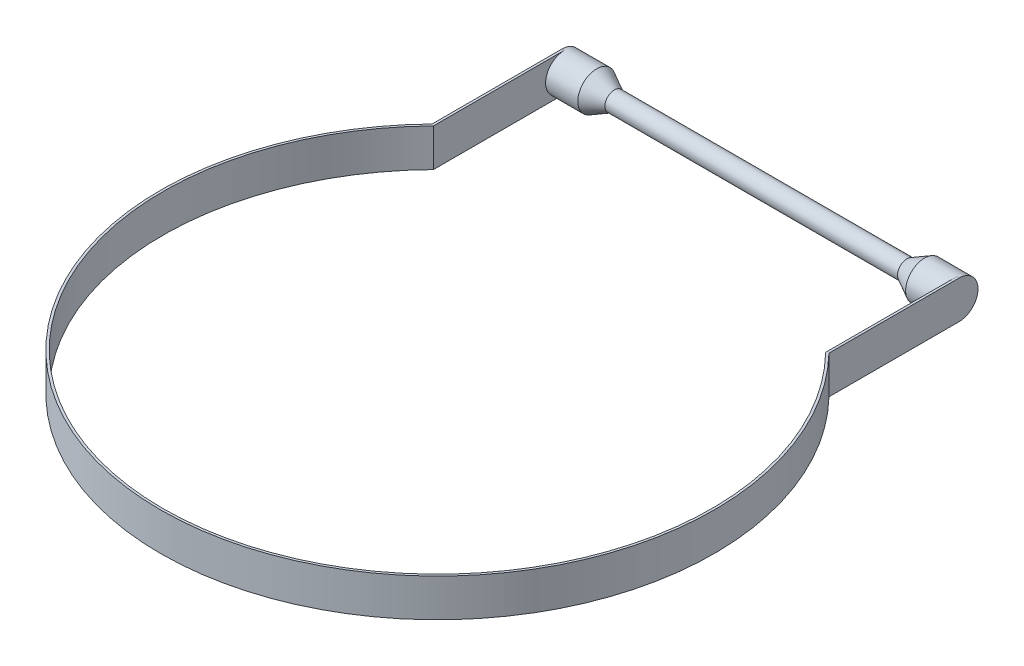
ISO-10303-21;
HEADER;
FILE_DESCRIPTION(('STEP AP214'),'2;1');
FILE_NAME('part.step','',(''),(''),'','','');
FILE_SCHEMA(('AUTOMOTIVE_DESIGN { 1 0 10303 214 1 1 1 1 }'));
ENDSEC;
DATA;
#1=APPLICATION_CONTEXT('core data for automotive mechanical design processes');
#2=APPLICATION_PROTOCOL_DEFINITION('international standard','automotive_design',2000,#1);
#3=PRODUCT_CONTEXT('',#1,'mechanical');
#4=PRODUCT('Part','Part','',(#3));
#5=PRODUCT_RELATED_PRODUCT_CATEGORY('part','',(#4));
#6=PRODUCT_DEFINITION_FORMATION('','',#4);
#7=PRODUCT_DEFINITION_CONTEXT('part definition',#1,'design');
#8=PRODUCT_DEFINITION('design','',#6,#7);
#9=PRODUCT_DEFINITION_SHAPE('','',#8);
#10=(LENGTH_UNIT() NAMED_UNIT(*) SI_UNIT(.MILLI.,.METRE.));
#11=(NAMED_UNIT(*) PLANE_ANGLE_UNIT() SI_UNIT($,.RADIAN.));
#12=(NAMED_UNIT(*) SI_UNIT($,.STERADIAN.) SOLID_ANGLE_UNIT());
#13=UNCERTAINTY_MEASURE_WITH_UNIT(LENGTH_MEASURE(1.E-05),#10,'distance_accuracy_value','');
#14=(GEOMETRIC_REPRESENTATION_CONTEXT(3) GLOBAL_UNCERTAINTY_ASSIGNED_CONTEXT((#13)) GLOBAL_UNIT_ASSIGNED_CONTEXT((#10,
#11,#12)) REPRESENTATION_CONTEXT('',''));
#15=CARTESIAN_POINT('',(0.,0.,0.));
#16=DIRECTION('',(0.,0.,1.));
#17=DIRECTION('',(1.,0.,0.));
#18=AXIS2_PLACEMENT_3D('',#15,#16,#17);
#19=CARTESIAN_POINT('',(-253.005,24.125,0.));
#20=DIRECTION('',(1.,0.,0.));
#21=DIRECTION('',(0.,0.,-1.));
#22=AXIS2_PLACEMENT_3D('',#19,#20,#21);
#23=PLANE('',#22);
#24=CARTESIAN_POINT('',(-253.005,0.,0.));
#25=DIRECTION('',(-1.,0.,0.));
#26=DIRECTION('',(0.,0.,1.));
#27=AXIS2_PLACEMENT_3D('',#24,#25,#26);
#28=CIRCLE('',#27,24.125);
#29=CARTESIAN_POINT('',(-253.005,24.125,0.));
#30=VERTEX_POINT('',#29);
#31=CARTESIAN_POINT('',(-253.005,-24.125,0.));
#32=VERTEX_POINT('',#31);
#33=EDGE_CURVE('E74',#30,#32,#28,.T.);
#34=ORIENTED_EDGE('',*,*,#33,.T.);
#35=DIRECTION('',(0.,0.,1.));
#36=VECTOR('',#35,1.);
#37=CARTESIAN_POINT('',(-253.005,-24.125,0.));
#38=LINE('',#37,#36);
#39=CARTESIAN_POINT('',(-253.005,-24.125,165.889796395397));
#40=VERTEX_POINT('',#39);
#41=EDGE_CURVE('E117',#32,#40,#38,.T.);
#42=ORIENTED_EDGE('',*,*,#41,.T.);
#43=DIRECTION('',(0.,-1.,0.));
#44=VECTOR('',#43,1.);
#45=CARTESIAN_POINT('',(-253.005,24.125,165.889796395397));
#46=LINE('',#45,#44);
#47=CARTESIAN_POINT('',(-253.005,24.125,165.889796395397));
#48=VERTEX_POINT('',#47);
#49=EDGE_CURVE('E157',#48,#40,#46,.T.);
#50=ORIENTED_EDGE('',*,*,#49,.F.);
#51=DIRECTION('',(0.,0.,1.));
#52=VECTOR('',#51,1.);
#53=CARTESIAN_POINT('',(-253.005,24.125,0.));
#54=LINE('',#53,#52);
#55=EDGE_CURVE('E119',#30,#48,#54,.T.);
#56=ORIENTED_EDGE('',*,*,#55,.F.);
#57=EDGE_LOOP('',(#34,#42,#50,#56));
#58=FACE_BOUND('',#57,.T.);
#59=ADVANCED_FACE('F52',(#58),#23,.F.);
#60=CARTESIAN_POINT('',(253.005,24.125,0.));
#61=DIRECTION('',(1.,0.,0.));
#62=DIRECTION('',(0.,0.,-1.));
#63=AXIS2_PLACEMENT_3D('',#60,#61,#62);
#64=PLANE('',#63);
#65=DIRECTION('',(0.,0.,1.));
#66=VECTOR('',#65,1.);
#67=CARTESIAN_POINT('',(253.005,-24.125,0.));
#68=LINE('',#67,#66);
#69=CARTESIAN_POINT('',(253.005,-24.125,0.));
#70=VERTEX_POINT('',#69);
#71=CARTESIAN_POINT('',(253.005,-24.125,165.889796395396));
#72=VERTEX_POINT('',#71);
#73=EDGE_CURVE('E133',#70,#72,#68,.T.);
#74=ORIENTED_EDGE('',*,*,#73,.F.);
#75=CARTESIAN_POINT('',(253.005,0.,0.));
#76=DIRECTION('',(1.,0.,0.));
#77=DIRECTION('',(0.,0.,-1.));
#78=AXIS2_PLACEMENT_3D('',#75,#76,#77);
#79=CIRCLE('',#78,24.125);
#80=CARTESIAN_POINT('',(253.005,24.125,0.));
#81=VERTEX_POINT('',#80);
#82=EDGE_CURVE('E66',#70,#81,#79,.T.);
#83=ORIENTED_EDGE('',*,*,#82,.T.);
#84=DIRECTION('',(0.,0.,1.));
#85=VECTOR('',#84,1.);
#86=CARTESIAN_POINT('',(253.005,24.125,0.));
#87=LINE('',#86,#85);
#88=CARTESIAN_POINT('',(253.005,24.125,165.889796395396));
#89=VERTEX_POINT('',#88);
#90=EDGE_CURVE('E184',#81,#89,#87,.T.);
#91=ORIENTED_EDGE('',*,*,#90,.T.);
#92=DIRECTION('',(0.,-1.,0.));
#93=VECTOR('',#92,1.);
#94=CARTESIAN_POINT('',(253.005,24.125,165.889796395396));
#95=LINE('',#94,#93);
#96=EDGE_CURVE('E154',#89,#72,#95,.T.);
#97=ORIENTED_EDGE('',*,*,#96,.T.);
#98=EDGE_LOOP('',(#74,#83,#91,#97));
#99=FACE_BOUND('',#98,.T.);
#100=ADVANCED_FACE('F207',(#99),#64,.T.);
#101=CARTESIAN_POINT('',(0.,-24.125,0.));
#102=DIRECTION('',(0.,1.,0.));
#103=DIRECTION('',(0.,0.,1.));
#104=AXIS2_PLACEMENT_3D('',#101,#102,#103);
#105=PLANE('',#104);
#106=DIRECTION('',(-1.,0.,0.));
#107=VECTOR('',#106,1.);
#108=CARTESIAN_POINT('',(353.005,-24.125,0.));
#109=LINE('',#108,#107);
#110=CARTESIAN_POINT('',(250.,-24.125,0.));
#111=VERTEX_POINT('',#110);
#112=EDGE_CURVE('E12',#70,#111,#109,.T.);
#113=ORIENTED_EDGE('',*,*,#112,.F.);
#114=ORIENTED_EDGE('',*,*,#73,.T.);
#115=CARTESIAN_POINT('',(0.,-24.125,412.0625));
#116=DIRECTION('',(0.,1.,0.));
#117=DIRECTION('',(0.,0.,1.));
#118=AXIS2_PLACEMENT_3D('',#115,#116,#117);
#119=CIRCLE('',#118,353.005);
#120=EDGE_CURVE('E130',#40,#72,#119,.T.);
#121=ORIENTED_EDGE('',*,*,#120,.F.);
#122=ORIENTED_EDGE('',*,*,#41,.F.);
#123=CARTESIAN_POINT('',(-250.,-24.125,0.));
#124=VERTEX_POINT('',#123);
#125=EDGE_CURVE('E56',#124,#32,#109,.T.);
#126=ORIENTED_EDGE('',*,*,#125,.F.);
#127=DIRECTION('',(0.,0.,1.));
#128=VECTOR('',#127,1.);
#129=CARTESIAN_POINT('',(-250.,-24.125,0.));
#130=LINE('',#129,#128);
#131=CARTESIAN_POINT('',(-250.,-24.125,167.113525721682));
#132=VERTEX_POINT('',#131);
#133=EDGE_CURVE('E146',#124,#132,#130,.T.);
#134=ORIENTED_EDGE('',*,*,#133,.T.);
#135=CARTESIAN_POINT('',(0.,-24.125,412.0625));
#136=DIRECTION('',(0.,1.,0.));
#137=DIRECTION('',(0.,0.,1.));
#138=AXIS2_PLACEMENT_3D('',#135,#136,#137);
#139=CIRCLE('',#138,350.);
#140=CARTESIAN_POINT('',(250.,-24.125,167.113525721682));
#141=VERTEX_POINT('',#140);
#142=EDGE_CURVE('E143',#132,#141,#139,.T.);
#143=ORIENTED_EDGE('',*,*,#142,.T.);
#144=DIRECTION('',(0.,0.,1.));
#145=VECTOR('',#144,1.);
#146=CARTESIAN_POINT('',(250.,-24.125,0.));
#147=LINE('',#146,#145);
#148=EDGE_CURVE('E141',#111,#141,#147,.T.);
#149=ORIENTED_EDGE('',*,*,#148,.F.);
#150=EDGE_LOOP('',(#113,#114,#121,#122,#126,#134,#143,#149));
#151=FACE_BOUND('',#150,.T.);
#152=ADVANCED_FACE('F128',(#151),#105,.F.);
#153=CARTESIAN_POINT('',(0.,24.125,0.));
#154=DIRECTION('',(0.,1.,0.));
#155=DIRECTION('',(0.,0.,1.));
#156=AXIS2_PLACEMENT_3D('',#153,#154,#155);
#157=PLANE('',#156);
#158=ORIENTED_EDGE('',*,*,#90,.F.);
#159=DIRECTION('',(-1.,0.,0.));
#160=VECTOR('',#159,1.);
#161=CARTESIAN_POINT('',(353.005,24.125,0.));
#162=LINE('',#161,#160);
#163=CARTESIAN_POINT('',(250.,24.125,0.));
#164=VERTEX_POINT('',#163);
#165=EDGE_CURVE('E127',#81,#164,#162,.T.);
#166=ORIENTED_EDGE('',*,*,#165,.T.);
#167=DIRECTION('',(0.,0.,1.));
#168=VECTOR('',#167,1.);
#169=CARTESIAN_POINT('',(250.,24.125,0.));
#170=LINE('',#169,#168);
#171=CARTESIAN_POINT('',(250.,24.125,167.113525721682));
#172=VERTEX_POINT('',#171);
#173=EDGE_CURVE('E181',#164,#172,#170,.T.);
#174=ORIENTED_EDGE('',*,*,#173,.T.);
#175=CARTESIAN_POINT('',(0.,24.125,412.0625));
#176=DIRECTION('',(0.,1.,0.));
#177=DIRECTION('',(0.,0.,1.));
#178=AXIS2_PLACEMENT_3D('',#175,#176,#177);
#179=CIRCLE('',#178,350.);
#180=CARTESIAN_POINT('',(-250.,24.125,167.113525721682));
#181=VERTEX_POINT('',#180);
#182=EDGE_CURVE('E189',#181,#172,#179,.T.);
#183=ORIENTED_EDGE('',*,*,#182,.F.);
#184=DIRECTION('',(0.,0.,1.));
#185=VECTOR('',#184,1.);
#186=CARTESIAN_POINT('',(-250.,24.125,0.));
#187=LINE('',#186,#185);
#188=CARTESIAN_POINT('',(-250.,24.125,0.));
#189=VERTEX_POINT('',#188);
#190=EDGE_CURVE('E137',#189,#181,#187,.T.);
#191=ORIENTED_EDGE('',*,*,#190,.F.);
#192=EDGE_CURVE('E174',#189,#30,#162,.T.);
#193=ORIENTED_EDGE('',*,*,#192,.T.);
#194=ORIENTED_EDGE('',*,*,#55,.T.);
#195=CARTESIAN_POINT('',(0.,24.125,412.0625));
#196=DIRECTION('',(0.,1.,0.));
#197=DIRECTION('',(0.,0.,1.));
#198=AXIS2_PLACEMENT_3D('',#195,#196,#197);
#199=CIRCLE('',#198,353.005);
#200=EDGE_CURVE('E200',#48,#89,#199,.T.);
#201=ORIENTED_EDGE('',*,*,#200,.T.);
#202=EDGE_LOOP('',(#158,#166,#174,#183,#191,#193,#194,#201));
#203=FACE_BOUND('',#202,.T.);
#204=ADVANCED_FACE('F179',(#203),#157,.T.);
#205=CARTESIAN_POINT('',(-250.,0.,0.));
#206=DIRECTION('',(-1.,0.,0.));
#207=DIRECTION('',(0.,0.,1.));
#208=AXIS2_PLACEMENT_3D('',#205,#206,#207);
#209=CYLINDRICAL_SURFACE('',#208,24.125);
#210=CARTESIAN_POINT('',(-250.,0.,0.));
#211=DIRECTION('',(-1.,0.,0.));
#212=DIRECTION('',(0.,0.,1.));
#213=AXIS2_PLACEMENT_3D('',#210,#211,#212);
#214=CIRCLE('',#213,24.125);
#215=EDGE_CURVE('E124',#124,#189,#214,.T.);
#216=ORIENTED_EDGE('',*,*,#215,.F.);
#217=ORIENTED_EDGE('',*,*,#125,.T.);
#218=ORIENTED_EDGE('',*,*,#33,.F.);
#219=ORIENTED_EDGE('',*,*,#192,.F.);
#220=EDGE_LOOP('',(#216,#217,#218,#219));
#221=FACE_BOUND('',#220,.T.);
#222=CARTESIAN_POINT('',(-209.,0.,0.));
#223=DIRECTION('',(-1.,0.,0.));
#224=DIRECTION('',(0.,0.,1.));
#225=AXIS2_PLACEMENT_3D('',#222,#223,#224);
#226=CIRCLE('',#225,24.125);
#227=CARTESIAN_POINT('',(-209.,0.,24.125));
#228=VERTEX_POINT('',#227);
#229=EDGE_CURVE('E171',#228,#228,#226,.T.);
#230=ORIENTED_EDGE('',*,*,#229,.T.);
#231=EDGE_LOOP('',(#230));
#232=FACE_BOUND('',#231,.T.);
#233=ADVANCED_FACE('F54',(#221,#232),#209,.T.);
#234=CARTESIAN_POINT('',(-186.495513174161,0.,0.));
#235=DIRECTION('',(-1.,0.,0.));
#236=DIRECTION('',(0.,0.,1.));
#237=AXIS2_PLACEMENT_3D('',#234,#235,#236);
#238=CONICAL_SURFACE('',#237,12.0625,0.492034432941357);
#239=ORIENTED_EDGE('',*,*,#229,.F.);
#240=EDGE_LOOP('',(#239));
#241=FACE_BOUND('',#240,.T.);
#242=CARTESIAN_POINT('',(-186.495513174161,0.,0.));
#243=DIRECTION('',(-1.,0.,0.));
#244=DIRECTION('',(0.,0.,1.));
#245=AXIS2_PLACEMENT_3D('',#242,#243,#244);
#246=CIRCLE('',#245,12.0625);
#247=CARTESIAN_POINT('',(-186.495513174161,0.,12.0625));
#248=VERTEX_POINT('',#247);
#249=EDGE_CURVE('E168',#248,#248,#246,.T.);
#250=ORIENTED_EDGE('',*,*,#249,.T.);
#251=EDGE_LOOP('',(#250));
#252=FACE_BOUND('',#251,.T.);
#253=ADVANCED_FACE('F231',(#241,#252),#238,.T.);
#254=CARTESIAN_POINT('',(-250.,0.,0.));
#255=DIRECTION('',(-1.,0.,0.));
#256=DIRECTION('',(0.,0.,1.));
#257=AXIS2_PLACEMENT_3D('',#254,#255,#256);
#258=CYLINDRICAL_SURFACE('',#257,12.0625);
#259=ORIENTED_EDGE('',*,*,#249,.F.);
#260=EDGE_LOOP('',(#259));
#261=FACE_BOUND('',#260,.T.);
#262=CARTESIAN_POINT('',(186.495513174161,0.,0.));
#263=DIRECTION('',(-1.,0.,0.));
#264=DIRECTION('',(0.,0.,1.));
#265=AXIS2_PLACEMENT_3D('',#262,#263,#264);
#266=CIRCLE('',#265,12.0625);
#267=CARTESIAN_POINT('',(186.495513174161,0.,12.0625));
#268=VERTEX_POINT('',#267);
#269=EDGE_CURVE('E165',#268,#268,#266,.T.);
#270=ORIENTED_EDGE('',*,*,#269,.T.);
#271=EDGE_LOOP('',(#270));
#272=FACE_BOUND('',#271,.T.);
#273=ADVANCED_FACE('F228',(#261,#272),#258,.T.);
#274=CARTESIAN_POINT('',(209.,0.,0.));
#275=DIRECTION('',(1.,0.,0.));
#276=DIRECTION('',(0.,0.,-1.));
#277=AXIS2_PLACEMENT_3D('',#274,#275,#276);
#278=CONICAL_SURFACE('',#277,24.125,0.492034432941357);
#279=ORIENTED_EDGE('',*,*,#269,.F.);
#280=EDGE_LOOP('',(#279));
#281=FACE_BOUND('',#280,.T.);
#282=CARTESIAN_POINT('',(209.,0.,0.));
#283=DIRECTION('',(-1.,0.,0.));
#284=DIRECTION('',(0.,0.,1.));
#285=AXIS2_PLACEMENT_3D('',#282,#283,#284);
#286=CIRCLE('',#285,24.125);
#287=CARTESIAN_POINT('',(209.,0.,24.125));
#288=VERTEX_POINT('',#287);
#289=EDGE_CURVE('E162',#288,#288,#286,.T.);
#290=ORIENTED_EDGE('',*,*,#289,.T.);
#291=EDGE_LOOP('',(#290));
#292=FACE_BOUND('',#291,.T.);
#293=ADVANCED_FACE('F224',(#281,#292),#278,.T.);
#294=CARTESIAN_POINT('',(-250.,0.,0.));
#295=DIRECTION('',(-1.,0.,0.));
#296=DIRECTION('',(0.,0.,1.));
#297=AXIS2_PLACEMENT_3D('',#294,#295,#296);
#298=CYLINDRICAL_SURFACE('',#297,24.125);
#299=ORIENTED_EDGE('',*,*,#289,.F.);
#300=EDGE_LOOP('',(#299));
#301=FACE_BOUND('',#300,.T.);
#302=ORIENTED_EDGE('',*,*,#112,.T.);
#303=CARTESIAN_POINT('',(250.,0.,0.));
#304=DIRECTION('',(-1.,0.,0.));
#305=DIRECTION('',(0.,0.,1.));
#306=AXIS2_PLACEMENT_3D('',#303,#304,#305);
#307=CIRCLE('',#306,24.125);
#308=EDGE_CURVE('E159',#111,#164,#307,.T.);
#309=ORIENTED_EDGE('',*,*,#308,.T.);
#310=ORIENTED_EDGE('',*,*,#165,.F.);
#311=ORIENTED_EDGE('',*,*,#82,.F.);
#312=EDGE_LOOP('',(#302,#309,#310,#311));
#313=FACE_BOUND('',#312,.T.);
#314=ADVANCED_FACE('F191',(#301,#313),#298,.T.);
#315=CARTESIAN_POINT('',(-250.,24.125,0.));
#316=DIRECTION('',(1.,0.,0.));
#317=DIRECTION('',(0.,0.,-1.));
#318=AXIS2_PLACEMENT_3D('',#315,#316,#317);
#319=PLANE('',#318);
#320=ORIENTED_EDGE('',*,*,#215,.T.);
#321=ORIENTED_EDGE('',*,*,#190,.T.);
#322=DIRECTION('',(0.,-1.,0.));
#323=VECTOR('',#322,1.);
#324=CARTESIAN_POINT('',(-250.,24.125,167.113525721682));
#325=LINE('',#324,#323);
#326=EDGE_CURVE('E148',#181,#132,#325,.T.);
#327=ORIENTED_EDGE('',*,*,#326,.T.);
#328=ORIENTED_EDGE('',*,*,#133,.F.);
#329=EDGE_LOOP('',(#320,#321,#327,#328));
#330=FACE_BOUND('',#329,.T.);
#331=ADVANCED_FACE('F223',(#330),#319,.T.);
#332=CARTESIAN_POINT('',(250.,24.125,0.));
#333=DIRECTION('',(1.,0.,0.));
#334=DIRECTION('',(0.,0.,-1.));
#335=AXIS2_PLACEMENT_3D('',#332,#333,#334);
#336=PLANE('',#335);
#337=ORIENTED_EDGE('',*,*,#173,.F.);
#338=ORIENTED_EDGE('',*,*,#308,.F.);
#339=ORIENTED_EDGE('',*,*,#148,.T.);
#340=DIRECTION('',(0.,-1.,0.));
#341=VECTOR('',#340,1.);
#342=CARTESIAN_POINT('',(250.,24.125,167.113525721682));
#343=LINE('',#342,#341);
#344=EDGE_CURVE('E151',#172,#141,#343,.T.);
#345=ORIENTED_EDGE('',*,*,#344,.F.);
#346=EDGE_LOOP('',(#337,#338,#339,#345));
#347=FACE_BOUND('',#346,.T.);
#348=ADVANCED_FACE('F187',(#347),#336,.F.);
#349=CARTESIAN_POINT('',(0.,24.125,412.0625));
#350=DIRECTION('',(0.,-1.,0.));
#351=DIRECTION('',(0.,0.,-1.));
#352=AXIS2_PLACEMENT_3D('',#349,#350,#351);
#353=CYLINDRICAL_SURFACE('',#352,353.005);
#354=ORIENTED_EDGE('',*,*,#120,.T.);
#355=ORIENTED_EDGE('',*,*,#96,.F.);
#356=ORIENTED_EDGE('',*,*,#200,.F.);
#357=ORIENTED_EDGE('',*,*,#49,.T.);
#358=EDGE_LOOP('',(#354,#355,#356,#357));
#359=FACE_BOUND('',#358,.T.);
#360=ADVANCED_FACE('F205',(#359),#353,.T.);
#361=CARTESIAN_POINT('',(0.,24.125,412.0625));
#362=DIRECTION('',(0.,-1.,0.));
#363=DIRECTION('',(0.,0.,-1.));
#364=AXIS2_PLACEMENT_3D('',#361,#362,#363);
#365=CYLINDRICAL_SURFACE('',#364,350.);
#366=ORIENTED_EDGE('',*,*,#142,.F.);
#367=ORIENTED_EDGE('',*,*,#326,.F.);
#368=ORIENTED_EDGE('',*,*,#182,.T.);
#369=ORIENTED_EDGE('',*,*,#344,.T.);
#370=EDGE_LOOP('',(#366,#367,#368,#369));
#371=FACE_BOUND('',#370,.T.);
#372=ADVANCED_FACE('F196',(#371),#365,.F.);
#373=CLOSED_SHELL('',(#59,#100,#152,#204,#233,#253,#273,#293,#314,#331,#348,#360,#372));
#374=MANIFOLD_SOLID_BREP('B2',#373);
#375=ADVANCED_BREP_SHAPE_REPRESENTATION('',(#18,#374),#14);
#376=SHAPE_DEFINITION_REPRESENTATION(#9,#375);
ENDSEC;
END-ISO-10303-21;
